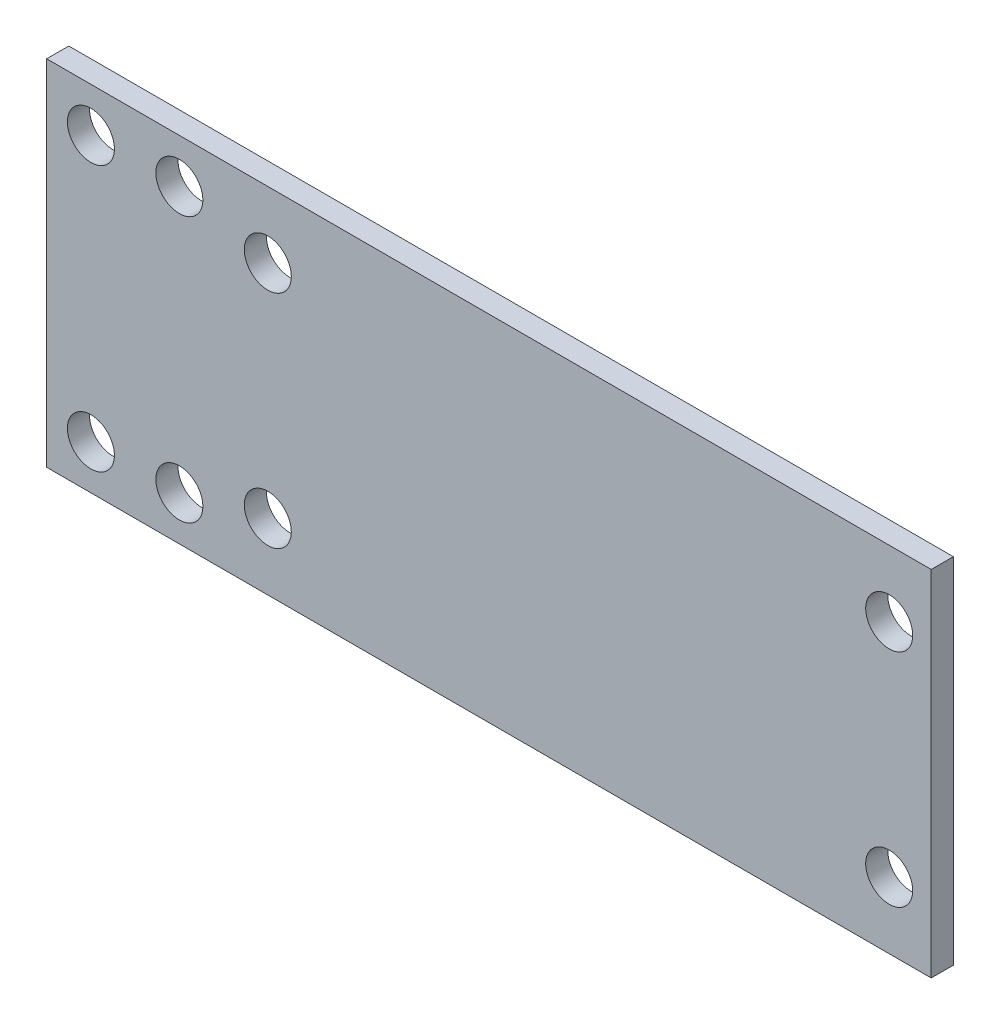
ISO-10303-21;
HEADER;
FILE_DESCRIPTION(('STEP AP214'),'2;1');
FILE_NAME('part.step','',(''),(''),'','','');
FILE_SCHEMA(('AUTOMOTIVE_DESIGN { 1 0 10303 214 1 1 1 1 }'));
ENDSEC;
DATA;
#1=APPLICATION_CONTEXT('core data for automotive mechanical design processes');
#2=APPLICATION_PROTOCOL_DEFINITION('international standard','automotive_design',2000,#1);
#3=PRODUCT_CONTEXT('',#1,'mechanical');
#4=PRODUCT('Part','Part','',(#3));
#5=PRODUCT_RELATED_PRODUCT_CATEGORY('part','',(#4));
#6=PRODUCT_DEFINITION_FORMATION('','',#4);
#7=PRODUCT_DEFINITION_CONTEXT('part definition',#1,'design');
#8=PRODUCT_DEFINITION('design','',#6,#7);
#9=PRODUCT_DEFINITION_SHAPE('','',#8);
#10=(LENGTH_UNIT() NAMED_UNIT(*) SI_UNIT(.MILLI.,.METRE.));
#11=(NAMED_UNIT(*) PLANE_ANGLE_UNIT() SI_UNIT($,.RADIAN.));
#12=(NAMED_UNIT(*) SI_UNIT($,.STERADIAN.) SOLID_ANGLE_UNIT());
#13=UNCERTAINTY_MEASURE_WITH_UNIT(LENGTH_MEASURE(1.E-05),#10,'distance_accuracy_value','');
#14=(GEOMETRIC_REPRESENTATION_CONTEXT(3) GLOBAL_UNCERTAINTY_ASSIGNED_CONTEXT((#13)) GLOBAL_UNIT_ASSIGNED_CONTEXT((#10,
#11,#12)) REPRESENTATION_CONTEXT('',''));
#15=CARTESIAN_POINT('',(0.,0.,0.));
#16=DIRECTION('',(0.,0.,1.));
#17=DIRECTION('',(1.,0.,0.));
#18=AXIS2_PLACEMENT_3D('',#15,#16,#17);
#19=CARTESIAN_POINT('',(-75.4217270194986,29.149860724234,3.175));
#20=DIRECTION('',(1.,0.,0.));
#21=DIRECTION('',(0.,0.,-1.));
#22=AXIS2_PLACEMENT_3D('',#19,#20,#21);
#23=PLANE('',#22);
#24=DIRECTION('',(0.,-1.,0.));
#25=VECTOR('',#24,1.);
#26=CARTESIAN_POINT('',(-75.4217270194986,29.149860724234,0.));
#27=LINE('',#26,#25);
#28=CARTESIAN_POINT('',(-75.4217270194986,29.149860724234,0.));
#29=VERTEX_POINT('',#28);
#30=CARTESIAN_POINT('',(-75.4217270194986,-21.650139275766,0.));
#31=VERTEX_POINT('',#30);
#32=EDGE_CURVE('E100',#29,#31,#27,.T.);
#33=ORIENTED_EDGE('',*,*,#32,.T.);
#34=DIRECTION('',(0.,0.,-1.));
#35=VECTOR('',#34,1.);
#36=CARTESIAN_POINT('',(-75.4217270194986,-21.650139275766,3.175));
#37=LINE('',#36,#35);
#38=CARTESIAN_POINT('',(-75.4217270194986,-21.650139275766,3.175));
#39=VERTEX_POINT('',#38);
#40=EDGE_CURVE('E11',#39,#31,#37,.T.);
#41=ORIENTED_EDGE('',*,*,#40,.F.);
#42=DIRECTION('',(0.,-1.,0.));
#43=VECTOR('',#42,1.);
#44=CARTESIAN_POINT('',(-75.4217270194986,29.149860724234,3.175));
#45=LINE('',#44,#43);
#46=CARTESIAN_POINT('',(-75.4217270194986,29.149860724234,3.175));
#47=VERTEX_POINT('',#46);
#48=EDGE_CURVE('E88',#47,#39,#45,.T.);
#49=ORIENTED_EDGE('',*,*,#48,.F.);
#50=DIRECTION('',(0.,0.,-1.));
#51=VECTOR('',#50,1.);
#52=CARTESIAN_POINT('',(-75.4217270194986,29.149860724234,3.175));
#53=LINE('',#52,#51);
#54=EDGE_CURVE('E96',#47,#29,#53,.T.);
#55=ORIENTED_EDGE('',*,*,#54,.T.);
#56=EDGE_LOOP('',(#33,#41,#49,#55));
#57=FACE_BOUND('',#56,.T.);
#58=ADVANCED_FACE('F37',(#57),#23,.F.);
#59=CARTESIAN_POINT('',(-75.4217270194986,-21.650139275766,3.175));
#60=DIRECTION('',(0.,1.,0.));
#61=DIRECTION('',(-1.,0.,0.));
#62=AXIS2_PLACEMENT_3D('',#59,#60,#61);
#63=PLANE('',#62);
#64=DIRECTION('',(1.,0.,0.));
#65=VECTOR('',#64,1.);
#66=CARTESIAN_POINT('',(-75.4217270194986,-21.650139275766,0.));
#67=LINE('',#66,#65);
#68=CARTESIAN_POINT('',(51.5782729805014,-21.650139275766,0.));
#69=VERTEX_POINT('',#68);
#70=EDGE_CURVE('E92',#31,#69,#67,.T.);
#71=ORIENTED_EDGE('',*,*,#70,.T.);
#72=DIRECTION('',(0.,0.,-1.));
#73=VECTOR('',#72,1.);
#74=CARTESIAN_POINT('',(51.5782729805014,-21.650139275766,3.175));
#75=LINE('',#74,#73);
#76=CARTESIAN_POINT('',(51.5782729805014,-21.650139275766,3.175));
#77=VERTEX_POINT('',#76);
#78=EDGE_CURVE('E45',#77,#69,#75,.T.);
#79=ORIENTED_EDGE('',*,*,#78,.F.);
#80=DIRECTION('',(1.,0.,0.));
#81=VECTOR('',#80,1.);
#82=CARTESIAN_POINT('',(-75.4217270194986,-21.650139275766,3.175));
#83=LINE('',#82,#81);
#84=EDGE_CURVE('E83',#39,#77,#83,.T.);
#85=ORIENTED_EDGE('',*,*,#84,.F.);
#86=ORIENTED_EDGE('',*,*,#40,.T.);
#87=EDGE_LOOP('',(#71,#79,#85,#86));
#88=FACE_BOUND('',#87,.T.);
#89=ADVANCED_FACE('F91',(#88),#63,.F.);
#90=CARTESIAN_POINT('',(51.5782729805014,29.149860724234,3.175));
#91=DIRECTION('',(-1.,0.,0.));
#92=DIRECTION('',(0.,0.,1.));
#93=AXIS2_PLACEMENT_3D('',#90,#91,#92);
#94=PLANE('',#93);
#95=DIRECTION('',(0.,1.,0.));
#96=VECTOR('',#95,1.);
#97=CARTESIAN_POINT('',(51.5782729805014,29.149860724234,0.));
#98=LINE('',#97,#96);
#99=CARTESIAN_POINT('',(51.5782729805014,29.149860724234,0.));
#100=VERTEX_POINT('',#99);
#101=EDGE_CURVE('E70',#69,#100,#98,.T.);
#102=ORIENTED_EDGE('',*,*,#101,.T.);
#103=DIRECTION('',(0.,0.,-1.));
#104=VECTOR('',#103,1.);
#105=CARTESIAN_POINT('',(51.5782729805014,29.149860724234,3.175));
#106=LINE('',#105,#104);
#107=CARTESIAN_POINT('',(51.5782729805014,29.149860724234,3.175));
#108=VERTEX_POINT('',#107);
#109=EDGE_CURVE('E93',#108,#100,#106,.T.);
#110=ORIENTED_EDGE('',*,*,#109,.F.);
#111=DIRECTION('',(0.,1.,0.));
#112=VECTOR('',#111,1.);
#113=CARTESIAN_POINT('',(51.5782729805014,29.149860724234,3.175));
#114=LINE('',#113,#112);
#115=EDGE_CURVE('E86',#77,#108,#114,.T.);
#116=ORIENTED_EDGE('',*,*,#115,.F.);
#117=ORIENTED_EDGE('',*,*,#78,.T.);
#118=EDGE_LOOP('',(#102,#110,#116,#117));
#119=FACE_BOUND('',#118,.T.);
#120=ADVANCED_FACE('F94',(#119),#94,.F.);
#121=CARTESIAN_POINT('',(-75.4217270194986,29.149860724234,3.175));
#122=DIRECTION('',(0.,-1.,0.));
#123=DIRECTION('',(0.,0.,-1.));
#124=AXIS2_PLACEMENT_3D('',#121,#122,#123);
#125=PLANE('',#124);
#126=DIRECTION('',(-1.,0.,0.));
#127=VECTOR('',#126,1.);
#128=CARTESIAN_POINT('',(-75.4217270194986,29.149860724234,0.));
#129=LINE('',#128,#127);
#130=EDGE_CURVE('E76',#100,#29,#129,.T.);
#131=ORIENTED_EDGE('',*,*,#130,.T.);
#132=ORIENTED_EDGE('',*,*,#54,.F.);
#133=DIRECTION('',(-1.,0.,0.));
#134=VECTOR('',#133,1.);
#135=CARTESIAN_POINT('',(-75.4217270194986,29.149860724234,3.175));
#136=LINE('',#135,#134);
#137=EDGE_CURVE('E53',#108,#47,#136,.T.);
#138=ORIENTED_EDGE('',*,*,#137,.F.);
#139=ORIENTED_EDGE('',*,*,#109,.T.);
#140=EDGE_LOOP('',(#131,#132,#138,#139));
#141=FACE_BOUND('',#140,.T.);
#142=ADVANCED_FACE('F108',(#141),#125,.F.);
#143=CARTESIAN_POINT('',(0.,0.,3.175));
#144=DIRECTION('',(0.,0.,1.));
#145=DIRECTION('',(1.,0.,0.));
#146=AXIS2_PLACEMENT_3D('',#143,#144,#145);
#147=PLANE('',#146);
#148=CARTESIAN_POINT('',(-69.0717270194986,22.799860724234,3.175));
#149=DIRECTION('',(0.,0.,1.));
#150=DIRECTION('',(1.,0.,0.));
#151=AXIS2_PLACEMENT_3D('',#148,#149,#150);
#152=CIRCLE('',#151,3.373501);
#153=CARTESIAN_POINT('',(-65.6982260194986,22.799860724234,3.175));
#154=VERTEX_POINT('',#153);
#155=EDGE_CURVE('E158',#154,#154,#152,.T.);
#156=ORIENTED_EDGE('',*,*,#155,.F.);
#157=EDGE_LOOP('',(#156));
#158=FACE_BOUND('',#157,.T.);
#159=CARTESIAN_POINT('',(-56.3717270194986,22.799860724234,3.175));
#160=DIRECTION('',(0.,0.,1.));
#161=DIRECTION('',(1.,0.,0.));
#162=AXIS2_PLACEMENT_3D('',#159,#160,#161);
#163=CIRCLE('',#162,3.373501);
#164=CARTESIAN_POINT('',(-52.9982260194986,22.799860724234,3.175));
#165=VERTEX_POINT('',#164);
#166=EDGE_CURVE('E152',#165,#165,#163,.T.);
#167=ORIENTED_EDGE('',*,*,#166,.F.);
#168=EDGE_LOOP('',(#167));
#169=FACE_BOUND('',#168,.T.);
#170=CARTESIAN_POINT('',(-56.3717270194986,-15.300139275766,3.175));
#171=DIRECTION('',(0.,0.,1.));
#172=DIRECTION('',(1.,0.,0.));
#173=AXIS2_PLACEMENT_3D('',#170,#171,#172);
#174=CIRCLE('',#173,3.373501);
#175=CARTESIAN_POINT('',(-52.9982260194986,-15.300139275766,3.175));
#176=VERTEX_POINT('',#175);
#177=EDGE_CURVE('E146',#176,#176,#174,.T.);
#178=ORIENTED_EDGE('',*,*,#177,.F.);
#179=EDGE_LOOP('',(#178));
#180=FACE_BOUND('',#179,.T.);
#181=CARTESIAN_POINT('',(-69.0717270194986,-15.300139275766,3.175));
#182=DIRECTION('',(0.,0.,1.));
#183=DIRECTION('',(1.,0.,0.));
#184=AXIS2_PLACEMENT_3D('',#181,#182,#183);
#185=CIRCLE('',#184,3.373501);
#186=CARTESIAN_POINT('',(-65.6982260194986,-15.300139275766,3.175));
#187=VERTEX_POINT('',#186);
#188=EDGE_CURVE('E140',#187,#187,#185,.T.);
#189=ORIENTED_EDGE('',*,*,#188,.F.);
#190=EDGE_LOOP('',(#189));
#191=FACE_BOUND('',#190,.T.);
#192=CARTESIAN_POINT('',(-43.6717270194987,19.624860724234,3.175));
#193=DIRECTION('',(0.,0.,1.));
#194=DIRECTION('',(1.,0.,0.));
#195=AXIS2_PLACEMENT_3D('',#192,#193,#194);
#196=CIRCLE('',#195,3.37350099999999);
#197=CARTESIAN_POINT('',(-40.2982260194987,19.624860724234,3.175));
#198=VERTEX_POINT('',#197);
#199=EDGE_CURVE('E134',#198,#198,#196,.T.);
#200=ORIENTED_EDGE('',*,*,#199,.F.);
#201=EDGE_LOOP('',(#200));
#202=FACE_BOUND('',#201,.T.);
#203=CARTESIAN_POINT('',(-43.6717270194987,-12.125139275766,3.175));
#204=DIRECTION('',(0.,0.,1.));
#205=DIRECTION('',(1.,0.,0.));
#206=AXIS2_PLACEMENT_3D('',#203,#204,#205);
#207=CIRCLE('',#206,3.37350099999999);
#208=CARTESIAN_POINT('',(-40.2982260194987,-12.125139275766,3.175));
#209=VERTEX_POINT('',#208);
#210=EDGE_CURVE('E128',#209,#209,#207,.T.);
#211=ORIENTED_EDGE('',*,*,#210,.F.);
#212=EDGE_LOOP('',(#211));
#213=FACE_BOUND('',#212,.T.);
#214=CARTESIAN_POINT('',(45.5457729805014,19.624860724234,3.175));
#215=DIRECTION('',(0.,0.,1.));
#216=DIRECTION('',(1.,0.,0.));
#217=AXIS2_PLACEMENT_3D('',#214,#215,#216);
#218=CIRCLE('',#217,3.37350099999999);
#219=CARTESIAN_POINT('',(48.9192739805014,19.624860724234,3.175));
#220=VERTEX_POINT('',#219);
#221=EDGE_CURVE('E122',#220,#220,#218,.T.);
#222=ORIENTED_EDGE('',*,*,#221,.F.);
#223=EDGE_LOOP('',(#222));
#224=FACE_BOUND('',#223,.T.);
#225=CARTESIAN_POINT('',(45.5457729805014,-12.125139275766,3.175));
#226=DIRECTION('',(0.,0.,1.));
#227=DIRECTION('',(1.,0.,0.));
#228=AXIS2_PLACEMENT_3D('',#225,#226,#227);
#229=CIRCLE('',#228,3.37350099999999);
#230=CARTESIAN_POINT('',(48.9192739805014,-12.125139275766,3.175));
#231=VERTEX_POINT('',#230);
#232=EDGE_CURVE('E116',#231,#231,#229,.T.);
#233=ORIENTED_EDGE('',*,*,#232,.F.);
#234=EDGE_LOOP('',(#233));
#235=FACE_BOUND('',#234,.T.);
#236=ORIENTED_EDGE('',*,*,#48,.T.);
#237=ORIENTED_EDGE('',*,*,#84,.T.);
#238=ORIENTED_EDGE('',*,*,#115,.T.);
#239=ORIENTED_EDGE('',*,*,#137,.T.);
#240=EDGE_LOOP('',(#236,#237,#238,#239));
#241=FACE_BOUND('',#240,.T.);
#242=ADVANCED_FACE('F84',(#158,#169,#180,#191,#202,#213,#224,#235,#241),#147,.T.);
#243=CARTESIAN_POINT('',(0.,0.,0.));
#244=DIRECTION('',(0.,0.,1.));
#245=DIRECTION('',(1.,0.,0.));
#246=AXIS2_PLACEMENT_3D('',#243,#244,#245);
#247=PLANE('',#246);
#248=CARTESIAN_POINT('',(-69.0717270194986,22.799860724234,0.));
#249=DIRECTION('',(0.,0.,1.));
#250=DIRECTION('',(1.,0.,0.));
#251=AXIS2_PLACEMENT_3D('',#248,#249,#250);
#252=CIRCLE('',#251,3.373501);
#253=CARTESIAN_POINT('',(-65.6982260194986,22.799860724234,0.));
#254=VERTEX_POINT('',#253);
#255=EDGE_CURVE('E155',#254,#254,#252,.T.);
#256=ORIENTED_EDGE('',*,*,#255,.T.);
#257=EDGE_LOOP('',(#256));
#258=FACE_BOUND('',#257,.T.);
#259=CARTESIAN_POINT('',(-56.3717270194986,22.799860724234,0.));
#260=DIRECTION('',(0.,0.,1.));
#261=DIRECTION('',(1.,0.,0.));
#262=AXIS2_PLACEMENT_3D('',#259,#260,#261);
#263=CIRCLE('',#262,3.373501);
#264=CARTESIAN_POINT('',(-52.9982260194986,22.799860724234,0.));
#265=VERTEX_POINT('',#264);
#266=EDGE_CURVE('E149',#265,#265,#263,.T.);
#267=ORIENTED_EDGE('',*,*,#266,.T.);
#268=EDGE_LOOP('',(#267));
#269=FACE_BOUND('',#268,.T.);
#270=CARTESIAN_POINT('',(-56.3717270194986,-15.300139275766,0.));
#271=DIRECTION('',(0.,0.,1.));
#272=DIRECTION('',(1.,0.,0.));
#273=AXIS2_PLACEMENT_3D('',#270,#271,#272);
#274=CIRCLE('',#273,3.373501);
#275=CARTESIAN_POINT('',(-52.9982260194986,-15.300139275766,0.));
#276=VERTEX_POINT('',#275);
#277=EDGE_CURVE('E143',#276,#276,#274,.T.);
#278=ORIENTED_EDGE('',*,*,#277,.T.);
#279=EDGE_LOOP('',(#278));
#280=FACE_BOUND('',#279,.T.);
#281=CARTESIAN_POINT('',(-69.0717270194986,-15.300139275766,0.));
#282=DIRECTION('',(0.,0.,1.));
#283=DIRECTION('',(1.,0.,0.));
#284=AXIS2_PLACEMENT_3D('',#281,#282,#283);
#285=CIRCLE('',#284,3.373501);
#286=CARTESIAN_POINT('',(-65.6982260194986,-15.300139275766,0.));
#287=VERTEX_POINT('',#286);
#288=EDGE_CURVE('E137',#287,#287,#285,.T.);
#289=ORIENTED_EDGE('',*,*,#288,.T.);
#290=EDGE_LOOP('',(#289));
#291=FACE_BOUND('',#290,.T.);
#292=CARTESIAN_POINT('',(-43.6717270194987,19.624860724234,0.));
#293=DIRECTION('',(0.,0.,1.));
#294=DIRECTION('',(1.,0.,0.));
#295=AXIS2_PLACEMENT_3D('',#292,#293,#294);
#296=CIRCLE('',#295,3.373501);
#297=CARTESIAN_POINT('',(-40.2982260194987,19.624860724234,0.));
#298=VERTEX_POINT('',#297);
#299=EDGE_CURVE('E131',#298,#298,#296,.T.);
#300=ORIENTED_EDGE('',*,*,#299,.T.);
#301=EDGE_LOOP('',(#300));
#302=FACE_BOUND('',#301,.T.);
#303=CARTESIAN_POINT('',(-43.6717270194987,-12.125139275766,0.));
#304=DIRECTION('',(0.,0.,1.));
#305=DIRECTION('',(1.,0.,0.));
#306=AXIS2_PLACEMENT_3D('',#303,#304,#305);
#307=CIRCLE('',#306,3.373501);
#308=CARTESIAN_POINT('',(-40.2982260194987,-12.125139275766,0.));
#309=VERTEX_POINT('',#308);
#310=EDGE_CURVE('E125',#309,#309,#307,.T.);
#311=ORIENTED_EDGE('',*,*,#310,.T.);
#312=EDGE_LOOP('',(#311));
#313=FACE_BOUND('',#312,.T.);
#314=CARTESIAN_POINT('',(45.5457729805014,19.624860724234,0.));
#315=DIRECTION('',(0.,0.,1.));
#316=DIRECTION('',(1.,0.,0.));
#317=AXIS2_PLACEMENT_3D('',#314,#315,#316);
#318=CIRCLE('',#317,3.373501);
#319=CARTESIAN_POINT('',(48.9192739805014,19.624860724234,0.));
#320=VERTEX_POINT('',#319);
#321=EDGE_CURVE('E119',#320,#320,#318,.T.);
#322=ORIENTED_EDGE('',*,*,#321,.T.);
#323=EDGE_LOOP('',(#322));
#324=FACE_BOUND('',#323,.T.);
#325=CARTESIAN_POINT('',(45.5457729805014,-12.125139275766,0.));
#326=DIRECTION('',(0.,0.,1.));
#327=DIRECTION('',(1.,0.,0.));
#328=AXIS2_PLACEMENT_3D('',#325,#326,#327);
#329=CIRCLE('',#328,3.373501);
#330=CARTESIAN_POINT('',(48.9192739805014,-12.125139275766,0.));
#331=VERTEX_POINT('',#330);
#332=EDGE_CURVE('E103',#331,#331,#329,.T.);
#333=ORIENTED_EDGE('',*,*,#332,.T.);
#334=EDGE_LOOP('',(#333));
#335=FACE_BOUND('',#334,.T.);
#336=ORIENTED_EDGE('',*,*,#32,.F.);
#337=ORIENTED_EDGE('',*,*,#130,.F.);
#338=ORIENTED_EDGE('',*,*,#101,.F.);
#339=ORIENTED_EDGE('',*,*,#70,.F.);
#340=EDGE_LOOP('',(#336,#337,#338,#339));
#341=FACE_BOUND('',#340,.T.);
#342=ADVANCED_FACE('F111',(#258,#269,#280,#291,#302,#313,#324,#335,#341),#247,.F.);
#343=CARTESIAN_POINT('',(45.5457729805014,-12.125139275766,3.175));
#344=DIRECTION('',(0.,0.,1.));
#345=DIRECTION('',(1.,0.,0.));
#346=AXIS2_PLACEMENT_3D('',#343,#344,#345);
#347=CYLINDRICAL_SURFACE('',#346,3.37350099999999);
#348=ORIENTED_EDGE('',*,*,#332,.F.);
#349=EDGE_LOOP('',(#348));
#350=FACE_BOUND('',#349,.T.);
#351=ORIENTED_EDGE('',*,*,#232,.T.);
#352=EDGE_LOOP('',(#351));
#353=FACE_BOUND('',#352,.T.);
#354=ADVANCED_FACE('F181',(#350,#353),#347,.F.);
#355=CARTESIAN_POINT('',(45.5457729805014,19.624860724234,3.175));
#356=DIRECTION('',(0.,0.,1.));
#357=DIRECTION('',(1.,0.,0.));
#358=AXIS2_PLACEMENT_3D('',#355,#356,#357);
#359=CYLINDRICAL_SURFACE('',#358,3.37350099999999);
#360=ORIENTED_EDGE('',*,*,#321,.F.);
#361=EDGE_LOOP('',(#360));
#362=FACE_BOUND('',#361,.T.);
#363=ORIENTED_EDGE('',*,*,#221,.T.);
#364=EDGE_LOOP('',(#363));
#365=FACE_BOUND('',#364,.T.);
#366=ADVANCED_FACE('F183',(#362,#365),#359,.F.);
#367=CARTESIAN_POINT('',(-43.6717270194987,-12.125139275766,3.175));
#368=DIRECTION('',(0.,0.,1.));
#369=DIRECTION('',(1.,0.,0.));
#370=AXIS2_PLACEMENT_3D('',#367,#368,#369);
#371=CYLINDRICAL_SURFACE('',#370,3.37350099999999);
#372=ORIENTED_EDGE('',*,*,#310,.F.);
#373=EDGE_LOOP('',(#372));
#374=FACE_BOUND('',#373,.T.);
#375=ORIENTED_EDGE('',*,*,#210,.T.);
#376=EDGE_LOOP('',(#375));
#377=FACE_BOUND('',#376,.T.);
#378=ADVANCED_FACE('F190',(#374,#377),#371,.F.);
#379=CARTESIAN_POINT('',(-43.6717270194987,19.624860724234,3.175));
#380=DIRECTION('',(0.,0.,1.));
#381=DIRECTION('',(1.,0.,0.));
#382=AXIS2_PLACEMENT_3D('',#379,#380,#381);
#383=CYLINDRICAL_SURFACE('',#382,3.37350099999999);
#384=ORIENTED_EDGE('',*,*,#299,.F.);
#385=EDGE_LOOP('',(#384));
#386=FACE_BOUND('',#385,.T.);
#387=ORIENTED_EDGE('',*,*,#199,.T.);
#388=EDGE_LOOP('',(#387));
#389=FACE_BOUND('',#388,.T.);
#390=ADVANCED_FACE('F235',(#386,#389),#383,.F.);
#391=CARTESIAN_POINT('',(-69.0717270194986,-15.300139275766,3.175));
#392=DIRECTION('',(0.,0.,1.));
#393=DIRECTION('',(1.,0.,0.));
#394=AXIS2_PLACEMENT_3D('',#391,#392,#393);
#395=CYLINDRICAL_SURFACE('',#394,3.373501);
#396=ORIENTED_EDGE('',*,*,#288,.F.);
#397=EDGE_LOOP('',(#396));
#398=FACE_BOUND('',#397,.T.);
#399=ORIENTED_EDGE('',*,*,#188,.T.);
#400=EDGE_LOOP('',(#399));
#401=FACE_BOUND('',#400,.T.);
#402=ADVANCED_FACE('F229',(#398,#401),#395,.F.);
#403=CARTESIAN_POINT('',(-56.3717270194986,-15.300139275766,3.175));
#404=DIRECTION('',(0.,0.,1.));
#405=DIRECTION('',(1.,0.,0.));
#406=AXIS2_PLACEMENT_3D('',#403,#404,#405);
#407=CYLINDRICAL_SURFACE('',#406,3.373501);
#408=ORIENTED_EDGE('',*,*,#277,.F.);
#409=EDGE_LOOP('',(#408));
#410=FACE_BOUND('',#409,.T.);
#411=ORIENTED_EDGE('',*,*,#177,.T.);
#412=EDGE_LOOP('',(#411));
#413=FACE_BOUND('',#412,.T.);
#414=ADVANCED_FACE('F234',(#410,#413),#407,.F.);
#415=CARTESIAN_POINT('',(-56.3717270194986,22.799860724234,3.175));
#416=DIRECTION('',(0.,0.,1.));
#417=DIRECTION('',(1.,0.,0.));
#418=AXIS2_PLACEMENT_3D('',#415,#416,#417);
#419=CYLINDRICAL_SURFACE('',#418,3.373501);
#420=ORIENTED_EDGE('',*,*,#266,.F.);
#421=EDGE_LOOP('',(#420));
#422=FACE_BOUND('',#421,.T.);
#423=ORIENTED_EDGE('',*,*,#166,.T.);
#424=EDGE_LOOP('',(#423));
#425=FACE_BOUND('',#424,.T.);
#426=ADVANCED_FACE('F248',(#422,#425),#419,.F.);
#427=CARTESIAN_POINT('',(-69.0717270194986,22.799860724234,3.175));
#428=DIRECTION('',(0.,0.,1.));
#429=DIRECTION('',(1.,0.,0.));
#430=AXIS2_PLACEMENT_3D('',#427,#428,#429);
#431=CYLINDRICAL_SURFACE('',#430,3.373501);
#432=ORIENTED_EDGE('',*,*,#255,.F.);
#433=EDGE_LOOP('',(#432));
#434=FACE_BOUND('',#433,.T.);
#435=ORIENTED_EDGE('',*,*,#155,.T.);
#436=EDGE_LOOP('',(#435));
#437=FACE_BOUND('',#436,.T.);
#438=ADVANCED_FACE('F162',(#434,#437),#431,.F.);
#439=CLOSED_SHELL('',(#58,#89,#120,#142,#242,#342,#354,#366,#378,#390,#402,#414,#426,#438));
#440=MANIFOLD_SOLID_BREP('B2',#439);
#441=ADVANCED_BREP_SHAPE_REPRESENTATION('',(#18,#440),#14);
#442=SHAPE_DEFINITION_REPRESENTATION(#9,#441);
ENDSEC;
END-ISO-10303-21;
